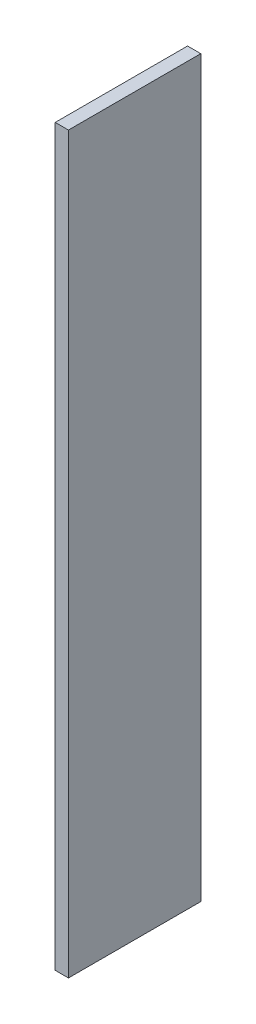
ISO-10303-21;
HEADER;
FILE_DESCRIPTION(('STEP AP214'),'2;1');
FILE_NAME('part.step','',(''),(''),'','','');
FILE_SCHEMA(('AUTOMOTIVE_DESIGN { 1 0 10303 214 1 1 1 1 }'));
ENDSEC;
DATA;
#1=APPLICATION_CONTEXT('core data for automotive mechanical design processes');
#2=APPLICATION_PROTOCOL_DEFINITION('international standard','automotive_design',2000,#1);
#3=PRODUCT_CONTEXT('',#1,'mechanical');
#4=PRODUCT('Part','Part','',(#3));
#5=PRODUCT_RELATED_PRODUCT_CATEGORY('part','',(#4));
#6=PRODUCT_DEFINITION_FORMATION('','',#4);
#7=PRODUCT_DEFINITION_CONTEXT('part definition',#1,'design');
#8=PRODUCT_DEFINITION('design','',#6,#7);
#9=PRODUCT_DEFINITION_SHAPE('','',#8);
#10=(LENGTH_UNIT() NAMED_UNIT(*) SI_UNIT(.MILLI.,.METRE.));
#11=(NAMED_UNIT(*) PLANE_ANGLE_UNIT() SI_UNIT($,.RADIAN.));
#12=(NAMED_UNIT(*) SI_UNIT($,.STERADIAN.) SOLID_ANGLE_UNIT());
#13=UNCERTAINTY_MEASURE_WITH_UNIT(LENGTH_MEASURE(1.E-05),#10,'distance_accuracy_value','');
#14=(GEOMETRIC_REPRESENTATION_CONTEXT(3) GLOBAL_UNCERTAINTY_ASSIGNED_CONTEXT((#13)) GLOBAL_UNIT_ASSIGNED_CONTEXT((#10,
#11,#12)) REPRESENTATION_CONTEXT('',''));
#15=CARTESIAN_POINT('',(0.,0.,0.));
#16=DIRECTION('',(0.,0.,1.));
#17=DIRECTION('',(1.,0.,0.));
#18=AXIS2_PLACEMENT_3D('',#15,#16,#17);
#19=CARTESIAN_POINT('',(1.,-55.5,-10.));
#20=DIRECTION('',(0.,0.,1.));
#21=DIRECTION('',(1.,0.,0.));
#22=AXIS2_PLACEMENT_3D('',#19,#20,#21);
#23=PLANE('',#22);
#24=DIRECTION('',(0.,1.,0.));
#25=VECTOR('',#24,1.);
#26=CARTESIAN_POINT('',(-1.,-55.5,-10.));
#27=LINE('',#26,#25);
#28=CARTESIAN_POINT('',(-1.,-55.5,-10.));
#29=VERTEX_POINT('',#28);
#30=CARTESIAN_POINT('',(-1.,55.5,-10.));
#31=VERTEX_POINT('',#30);
#32=EDGE_CURVE('E107',#29,#31,#27,.T.);
#33=ORIENTED_EDGE('',*,*,#32,.T.);
#34=DIRECTION('',(-1.,0.,0.));
#35=VECTOR('',#34,1.);
#36=CARTESIAN_POINT('',(1.,55.5,-10.));
#37=LINE('',#36,#35);
#38=CARTESIAN_POINT('',(1.,55.5,-10.));
#39=VERTEX_POINT('',#38);
#40=EDGE_CURVE('E11',#39,#31,#37,.T.);
#41=ORIENTED_EDGE('',*,*,#40,.F.);
#42=DIRECTION('',(0.,1.,0.));
#43=VECTOR('',#42,1.);
#44=CARTESIAN_POINT('',(1.,-55.5,-10.));
#45=LINE('',#44,#43);
#46=CARTESIAN_POINT('',(1.,-55.5,-10.));
#47=VERTEX_POINT('',#46);
#48=EDGE_CURVE('E91',#47,#39,#45,.T.);
#49=ORIENTED_EDGE('',*,*,#48,.F.);
#50=DIRECTION('',(-1.,0.,0.));
#51=VECTOR('',#50,1.);
#52=CARTESIAN_POINT('',(1.,-55.5,-10.));
#53=LINE('',#52,#51);
#54=EDGE_CURVE('E103',#47,#29,#53,.T.);
#55=ORIENTED_EDGE('',*,*,#54,.T.);
#56=EDGE_LOOP('',(#33,#41,#49,#55));
#57=FACE_BOUND('',#56,.T.);
#58=ADVANCED_FACE('F39',(#57),#23,.F.);
#59=CARTESIAN_POINT('',(1.,55.5,10.));
#60=DIRECTION('',(0.,-1.,0.));
#61=DIRECTION('',(0.,0.,-1.));
#62=AXIS2_PLACEMENT_3D('',#59,#60,#61);
#63=PLANE('',#62);
#64=DIRECTION('',(0.,0.,1.));
#65=VECTOR('',#64,1.);
#66=CARTESIAN_POINT('',(-1.,55.5,10.));
#67=LINE('',#66,#65);
#68=CARTESIAN_POINT('',(-1.,55.5,10.));
#69=VERTEX_POINT('',#68);
#70=EDGE_CURVE('E96',#31,#69,#67,.T.);
#71=ORIENTED_EDGE('',*,*,#70,.T.);
#72=DIRECTION('',(-1.,0.,0.));
#73=VECTOR('',#72,1.);
#74=CARTESIAN_POINT('',(1.,55.5,10.));
#75=LINE('',#74,#73);
#76=CARTESIAN_POINT('',(1.,55.5,10.));
#77=VERTEX_POINT('',#76);
#78=EDGE_CURVE('E48',#77,#69,#75,.T.);
#79=ORIENTED_EDGE('',*,*,#78,.F.);
#80=DIRECTION('',(0.,0.,1.));
#81=VECTOR('',#80,1.);
#82=CARTESIAN_POINT('',(1.,55.5,10.));
#83=LINE('',#82,#81);
#84=EDGE_CURVE('E86',#39,#77,#83,.T.);
#85=ORIENTED_EDGE('',*,*,#84,.F.);
#86=ORIENTED_EDGE('',*,*,#40,.T.);
#87=EDGE_LOOP('',(#71,#79,#85,#86));
#88=FACE_BOUND('',#87,.T.);
#89=ADVANCED_FACE('F95',(#88),#63,.F.);
#90=CARTESIAN_POINT('',(1.,-55.5,10.));
#91=DIRECTION('',(0.,0.,-1.));
#92=DIRECTION('',(-1.,0.,0.));
#93=AXIS2_PLACEMENT_3D('',#90,#91,#92);
#94=PLANE('',#93);
#95=DIRECTION('',(0.,-1.,0.));
#96=VECTOR('',#95,1.);
#97=CARTESIAN_POINT('',(-1.,-55.5,10.));
#98=LINE('',#97,#96);
#99=CARTESIAN_POINT('',(-1.,-55.5,10.));
#100=VERTEX_POINT('',#99);
#101=EDGE_CURVE('E73',#69,#100,#98,.T.);
#102=ORIENTED_EDGE('',*,*,#101,.T.);
#103=DIRECTION('',(-1.,0.,0.));
#104=VECTOR('',#103,1.);
#105=CARTESIAN_POINT('',(1.,-55.5,10.));
#106=LINE('',#105,#104);
#107=CARTESIAN_POINT('',(1.,-55.5,10.));
#108=VERTEX_POINT('',#107);
#109=EDGE_CURVE('E98',#108,#100,#106,.T.);
#110=ORIENTED_EDGE('',*,*,#109,.F.);
#111=DIRECTION('',(0.,-1.,0.));
#112=VECTOR('',#111,1.);
#113=CARTESIAN_POINT('',(1.,-55.5,10.));
#114=LINE('',#113,#112);
#115=EDGE_CURVE('E89',#77,#108,#114,.T.);
#116=ORIENTED_EDGE('',*,*,#115,.F.);
#117=ORIENTED_EDGE('',*,*,#78,.T.);
#118=EDGE_LOOP('',(#102,#110,#116,#117));
#119=FACE_BOUND('',#118,.T.);
#120=ADVANCED_FACE('F99',(#119),#94,.F.);
#121=CARTESIAN_POINT('',(1.,-55.5,10.));
#122=DIRECTION('',(0.,1.,0.));
#123=DIRECTION('',(0.,0.,1.));
#124=AXIS2_PLACEMENT_3D('',#121,#122,#123);
#125=PLANE('',#124);
#126=DIRECTION('',(0.,0.,-1.));
#127=VECTOR('',#126,1.);
#128=CARTESIAN_POINT('',(-1.,-55.5,10.));
#129=LINE('',#128,#127);
#130=EDGE_CURVE('E79',#100,#29,#129,.T.);
#131=ORIENTED_EDGE('',*,*,#130,.T.);
#132=ORIENTED_EDGE('',*,*,#54,.F.);
#133=DIRECTION('',(0.,0.,-1.));
#134=VECTOR('',#133,1.);
#135=CARTESIAN_POINT('',(1.,-55.5,10.));
#136=LINE('',#135,#134);
#137=EDGE_CURVE('E56',#108,#47,#136,.T.);
#138=ORIENTED_EDGE('',*,*,#137,.F.);
#139=ORIENTED_EDGE('',*,*,#109,.T.);
#140=EDGE_LOOP('',(#131,#132,#138,#139));
#141=FACE_BOUND('',#140,.T.);
#142=ADVANCED_FACE('F120',(#141),#125,.F.);
#143=CARTESIAN_POINT('',(1.,0.,0.));
#144=DIRECTION('',(-1.,0.,0.));
#145=DIRECTION('',(0.,0.,1.));
#146=AXIS2_PLACEMENT_3D('',#143,#144,#145);
#147=PLANE('',#146);
#148=ORIENTED_EDGE('',*,*,#48,.T.);
#149=ORIENTED_EDGE('',*,*,#84,.T.);
#150=ORIENTED_EDGE('',*,*,#115,.T.);
#151=ORIENTED_EDGE('',*,*,#137,.T.);
#152=EDGE_LOOP('',(#148,#149,#150,#151));
#153=FACE_BOUND('',#152,.T.);
#154=ADVANCED_FACE('F87',(#153),#147,.F.);
#155=CARTESIAN_POINT('',(-1.,0.,0.));
#156=DIRECTION('',(-1.,0.,0.));
#157=DIRECTION('',(0.,0.,1.));
#158=AXIS2_PLACEMENT_3D('',#155,#156,#157);
#159=PLANE('',#158);
#160=ORIENTED_EDGE('',*,*,#32,.F.);
#161=ORIENTED_EDGE('',*,*,#130,.F.);
#162=ORIENTED_EDGE('',*,*,#101,.F.);
#163=ORIENTED_EDGE('',*,*,#70,.F.);
#164=EDGE_LOOP('',(#160,#161,#162,#163));
#165=FACE_BOUND('',#164,.T.);
#166=ADVANCED_FACE('F123',(#165),#159,.T.);
#167=CLOSED_SHELL('',(#58,#89,#120,#142,#154,#166));
#168=MANIFOLD_SOLID_BREP('B2',#167);
#169=ADVANCED_BREP_SHAPE_REPRESENTATION('',(#18,#168),#14);
#170=SHAPE_DEFINITION_REPRESENTATION(#9,#169);
ENDSEC;
END-ISO-10303-21;
